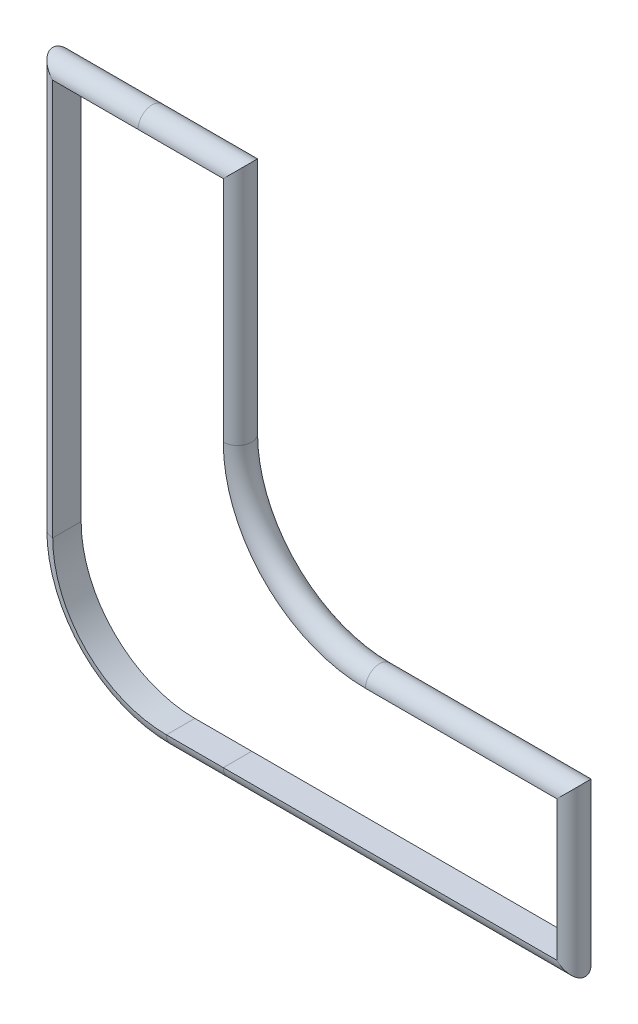
ISO-10303-21;
HEADER;
FILE_DESCRIPTION(('STEP AP214'),'2;1');
FILE_NAME('part.step','',(''),(''),'','','');
FILE_SCHEMA(('AUTOMOTIVE_DESIGN { 1 0 10303 214 1 1 1 1 }'));
ENDSEC;
DATA;
#1=APPLICATION_CONTEXT('core data for automotive mechanical design processes');
#2=APPLICATION_PROTOCOL_DEFINITION('international standard','automotive_design',2000,#1);
#3=PRODUCT_CONTEXT('',#1,'mechanical');
#4=PRODUCT('Part','Part','',(#3));
#5=PRODUCT_RELATED_PRODUCT_CATEGORY('part','',(#4));
#6=PRODUCT_DEFINITION_FORMATION('','',#4);
#7=PRODUCT_DEFINITION_CONTEXT('part definition',#1,'design');
#8=PRODUCT_DEFINITION('design','',#6,#7);
#9=PRODUCT_DEFINITION_SHAPE('','',#8);
#10=(LENGTH_UNIT() NAMED_UNIT(*) SI_UNIT(.MILLI.,.METRE.));
#11=(NAMED_UNIT(*) PLANE_ANGLE_UNIT() SI_UNIT($,.RADIAN.));
#12=(NAMED_UNIT(*) SI_UNIT($,.STERADIAN.) SOLID_ANGLE_UNIT());
#13=UNCERTAINTY_MEASURE_WITH_UNIT(LENGTH_MEASURE(1.E-05),#10,'distance_accuracy_value','');
#14=(GEOMETRIC_REPRESENTATION_CONTEXT(3) GLOBAL_UNCERTAINTY_ASSIGNED_CONTEXT((#13)) GLOBAL_UNIT_ASSIGNED_CONTEXT((#10,
#11,#12)) REPRESENTATION_CONTEXT('',''));
#15=CARTESIAN_POINT('',(0.,0.,0.));
#16=DIRECTION('',(0.,0.,1.));
#17=DIRECTION('',(1.,0.,0.));
#18=AXIS2_PLACEMENT_3D('',#15,#16,#17);
#19=CARTESIAN_POINT('',(0.936808624207441,-0.547273546102289,0.));
#20=DIRECTION('',(-1.,0.,0.));
#21=DIRECTION('',(0.,0.,1.));
#22=AXIS2_PLACEMENT_3D('',#19,#20,#21);
#23=CYLINDRICAL_SURFACE('',#22,0.025);
#24=CARTESIAN_POINT('',(0.736808624207441,-0.547273546102289,0.));
#25=DIRECTION('',(-0.707106781186547,-0.707106781186548,0.));
#26=DIRECTION('',(0.707106781186548,-0.707106781186547,0.));
#27=AXIS2_PLACEMENT_3D('',#24,#25,#26);
#28=ELLIPSE('',#27,0.0353553390593274,0.025);
#29=CARTESIAN_POINT('',(0.736808624207441,-0.547273546102289,0.025));
#30=VERTEX_POINT('',#29);
#31=CARTESIAN_POINT('',(0.736808624207441,-0.547273546102289,-0.025));
#32=VERTEX_POINT('',#31);
#33=EDGE_CURVE('E157',#30,#32,#28,.F.);
#34=ORIENTED_EDGE('',*,*,#33,.F.);
#35=DIRECTION('',(-1.,0.,0.));
#36=VECTOR('',#35,1.);
#37=CARTESIAN_POINT('',(0.936808624207441,-0.547273546102289,0.025));
#38=LINE('',#37,#36);
#39=CARTESIAN_POINT('',(0.15,-0.547273546102289,0.025));
#40=VERTEX_POINT('',#39);
#41=EDGE_CURVE('E173',#30,#40,#38,.T.);
#42=ORIENTED_EDGE('',*,*,#41,.T.);
#43=CARTESIAN_POINT('',(0.15,-0.547273546102289,0.));
#44=DIRECTION('',(-1.,0.,0.));
#45=DIRECTION('',(0.,0.,-1.));
#46=AXIS2_PLACEMENT_3D('',#43,#44,#45);
#47=CIRCLE('',#46,0.025);
#48=CARTESIAN_POINT('',(0.15,-0.547273546102289,-0.025));
#49=VERTEX_POINT('',#48);
#50=EDGE_CURVE('E133',#49,#40,#47,.T.);
#51=ORIENTED_EDGE('',*,*,#50,.F.);
#52=DIRECTION('',(-1.,0.,0.));
#53=VECTOR('',#52,1.);
#54=CARTESIAN_POINT('',(0.936808624207441,-0.547273546102289,-0.025));
#55=LINE('',#54,#53);
#56=EDGE_CURVE('E171',#32,#49,#55,.T.);
#57=ORIENTED_EDGE('',*,*,#56,.F.);
#58=EDGE_LOOP('',(#34,#42,#51,#57));
#59=FACE_BOUND('',#58,.T.);
#60=ADVANCED_FACE('F33',(#59),#23,.T.);
#61=CARTESIAN_POINT('',(0.936808624207441,-0.547273546102289,0.025));
#62=DIRECTION('',(0.,1.,0.));
#63=DIRECTION('',(0.,0.,1.));
#64=AXIS2_PLACEMENT_3D('',#61,#62,#63);
#65=PLANE('',#64);
#66=DIRECTION('',(0.,0.,1.));
#67=VECTOR('',#66,1.);
#68=CARTESIAN_POINT('',(0.736808624207441,-0.547273546102289,0.025));
#69=LINE('',#68,#67);
#70=EDGE_CURVE('E105',#32,#30,#69,.T.);
#71=ORIENTED_EDGE('',*,*,#70,.F.);
#72=ORIENTED_EDGE('',*,*,#56,.T.);
#73=DIRECTION('',(0.,0.,-1.));
#74=VECTOR('',#73,1.);
#75=CARTESIAN_POINT('',(0.15,-0.547273546102289,0.025));
#76=LINE('',#75,#74);
#77=EDGE_CURVE('E130',#40,#49,#76,.T.);
#78=ORIENTED_EDGE('',*,*,#77,.F.);
#79=ORIENTED_EDGE('',*,*,#41,.F.);
#80=EDGE_LOOP('',(#71,#72,#78,#79));
#81=FACE_BOUND('',#80,.T.);
#82=ADVANCED_FACE('F191',(#81),#65,.T.);
#83=CARTESIAN_POINT('',(0.15,-0.547273546102289,0.));
#84=DIRECTION('',(-1.,0.,0.));
#85=DIRECTION('',(0.,-1.,0.));
#86=AXIS2_PLACEMENT_3D('',#83,#84,#85);
#87=CYLINDRICAL_SURFACE('',#86,0.025);
#88=DIRECTION('',(-1.,0.,0.));
#89=VECTOR('',#88,1.);
#90=CARTESIAN_POINT('',(0.15,-0.547273546102289,0.025));
#91=LINE('',#90,#89);
#92=CARTESIAN_POINT('',(0.0500000000000001,-0.547273546102289,0.025));
#93=VERTEX_POINT('',#92);
#94=EDGE_CURVE('E134',#40,#93,#91,.T.);
#95=ORIENTED_EDGE('',*,*,#94,.T.);
#96=CARTESIAN_POINT('',(0.0500000000000001,-0.547273546102289,0.));
#97=DIRECTION('',(-1.,0.,0.));
#98=DIRECTION('',(0.,0.,-1.));
#99=AXIS2_PLACEMENT_3D('',#96,#97,#98);
#100=CIRCLE('',#99,0.025);
#101=CARTESIAN_POINT('',(0.0500000000000001,-0.547273546102289,-0.025));
#102=VERTEX_POINT('',#101);
#103=EDGE_CURVE('E120',#102,#93,#100,.T.);
#104=ORIENTED_EDGE('',*,*,#103,.F.);
#105=DIRECTION('',(-1.,0.,0.));
#106=VECTOR('',#105,1.);
#107=CARTESIAN_POINT('',(0.15,-0.547273546102289,-0.025));
#108=LINE('',#107,#106);
#109=EDGE_CURVE('E127',#49,#102,#108,.T.);
#110=ORIENTED_EDGE('',*,*,#109,.F.);
#111=ORIENTED_EDGE('',*,*,#50,.T.);
#112=EDGE_LOOP('',(#95,#104,#110,#111));
#113=FACE_BOUND('',#112,.T.);
#114=ADVANCED_FACE('F181',(#113),#87,.T.);
#115=CARTESIAN_POINT('',(0.15,-0.547273546102289,0.025));
#116=DIRECTION('',(0.,1.,0.));
#117=DIRECTION('',(-1.,0.,0.));
#118=AXIS2_PLACEMENT_3D('',#115,#116,#117);
#119=PLANE('',#118);
#120=DIRECTION('',(0.,0.,-1.));
#121=VECTOR('',#120,1.);
#122=CARTESIAN_POINT('',(0.0500000000000001,-0.547273546102289,0.025));
#123=LINE('',#122,#121);
#124=EDGE_CURVE('E124',#93,#102,#123,.T.);
#125=ORIENTED_EDGE('',*,*,#124,.F.);
#126=ORIENTED_EDGE('',*,*,#94,.F.);
#127=ORIENTED_EDGE('',*,*,#77,.T.);
#128=ORIENTED_EDGE('',*,*,#109,.T.);
#129=EDGE_LOOP('',(#125,#126,#127,#128));
#130=FACE_BOUND('',#129,.T.);
#131=ADVANCED_FACE('F187',(#130),#119,.T.);
#132=CARTESIAN_POINT('',(0.05,-0.347273546102289,0.));
#133=DIRECTION('',(0.,0.,-1.));
#134=DIRECTION('',(-1.,0.,0.));
#135=AXIS2_PLACEMENT_3D('',#132,#133,#134);
#136=TOROIDAL_SURFACE('',#135,0.2,0.025);
#137=CARTESIAN_POINT('',(0.05,-0.347273546102289,0.025));
#138=DIRECTION('',(0.,0.,-1.));
#139=DIRECTION('',(0.,-1.,0.));
#140=AXIS2_PLACEMENT_3D('',#137,#138,#139);
#141=CIRCLE('',#140,0.2);
#142=CARTESIAN_POINT('',(-0.15,-0.347273546102289,0.025));
#143=VERTEX_POINT('',#142);
#144=EDGE_CURVE('E111',#93,#143,#141,.T.);
#145=ORIENTED_EDGE('',*,*,#144,.T.);
#146=CARTESIAN_POINT('',(-0.15,-0.347273546102289,0.));
#147=DIRECTION('',(0.,1.,0.));
#148=DIRECTION('',(0.,0.,-1.));
#149=AXIS2_PLACEMENT_3D('',#146,#147,#148);
#150=CIRCLE('',#149,0.025);
#151=CARTESIAN_POINT('',(-0.15,-0.347273546102289,-0.025));
#152=VERTEX_POINT('',#151);
#153=EDGE_CURVE('E118',#152,#143,#150,.T.);
#154=ORIENTED_EDGE('',*,*,#153,.F.);
#155=CARTESIAN_POINT('',(0.05,-0.347273546102289,-0.025));
#156=DIRECTION('',(0.,0.,-1.));
#157=DIRECTION('',(0.,-1.,0.));
#158=AXIS2_PLACEMENT_3D('',#155,#156,#157);
#159=CIRCLE('',#158,0.2);
#160=EDGE_CURVE('E113',#102,#152,#159,.T.);
#161=ORIENTED_EDGE('',*,*,#160,.F.);
#162=ORIENTED_EDGE('',*,*,#103,.T.);
#163=EDGE_LOOP('',(#145,#154,#161,#162));
#164=FACE_BOUND('',#163,.T.);
#165=ADVANCED_FACE('F117',(#164),#136,.T.);
#166=CARTESIAN_POINT('',(0.05,-0.347273546102289,0.));
#167=DIRECTION('',(0.,0.,-1.));
#168=DIRECTION('',(-1.,0.,0.));
#169=AXIS2_PLACEMENT_3D('',#166,#167,#168);
#170=CYLINDRICAL_SURFACE('',#169,0.2);
#171=DIRECTION('',(0.,0.,-1.));
#172=VECTOR('',#171,1.);
#173=CARTESIAN_POINT('',(-0.15,-0.347273546102289,0.025));
#174=LINE('',#173,#172);
#175=EDGE_CURVE('E100',#143,#152,#174,.T.);
#176=ORIENTED_EDGE('',*,*,#175,.F.);
#177=ORIENTED_EDGE('',*,*,#144,.F.);
#178=ORIENTED_EDGE('',*,*,#124,.T.);
#179=ORIENTED_EDGE('',*,*,#160,.T.);
#180=EDGE_LOOP('',(#176,#177,#178,#179));
#181=FACE_BOUND('',#180,.T.);
#182=ADVANCED_FACE('F109',(#181),#170,.F.);
#183=CARTESIAN_POINT('',(-0.15,-0.347273546102289,0.));
#184=DIRECTION('',(0.,1.,0.));
#185=DIRECTION('',(-1.,0.,0.));
#186=AXIS2_PLACEMENT_3D('',#183,#184,#185);
#187=CYLINDRICAL_SURFACE('',#186,0.025);
#188=DIRECTION('',(0.,1.,0.));
#189=VECTOR('',#188,1.);
#190=CARTESIAN_POINT('',(-0.15,-0.347273546102289,0.025));
#191=LINE('',#190,#189);
#192=CARTESIAN_POINT('',(-0.15,0.35,0.025));
#193=VERTEX_POINT('',#192);
#194=EDGE_CURVE('E37',#143,#193,#191,.T.);
#195=ORIENTED_EDGE('',*,*,#194,.T.);
#196=CARTESIAN_POINT('',(-0.15,0.35,0.));
#197=DIRECTION('',(0.707106781186548,0.707106781186548,0.));
#198=DIRECTION('',(0.707106781186548,-0.707106781186548,0.));
#199=AXIS2_PLACEMENT_3D('',#196,#197,#198);
#200=ELLIPSE('',#199,0.0353553390593273,0.025);
#201=CARTESIAN_POINT('',(-0.15,0.35,-0.025));
#202=VERTEX_POINT('',#201);
#203=EDGE_CURVE('E143',#193,#202,#200,.F.);
#204=ORIENTED_EDGE('',*,*,#203,.T.);
#205=DIRECTION('',(0.,1.,0.));
#206=VECTOR('',#205,1.);
#207=CARTESIAN_POINT('',(-0.15,-0.347273546102289,-0.025));
#208=LINE('',#207,#206);
#209=EDGE_CURVE('E94',#152,#202,#208,.T.);
#210=ORIENTED_EDGE('',*,*,#209,.F.);
#211=ORIENTED_EDGE('',*,*,#153,.T.);
#212=EDGE_LOOP('',(#195,#204,#210,#211));
#213=FACE_BOUND('',#212,.T.);
#214=ADVANCED_FACE('F122',(#213),#187,.T.);
#215=CARTESIAN_POINT('',(-0.15,-0.347273546102289,0.025));
#216=DIRECTION('',(1.,0.,0.));
#217=DIRECTION('',(0.,1.,0.));
#218=AXIS2_PLACEMENT_3D('',#215,#216,#217);
#219=PLANE('',#218);
#220=ORIENTED_EDGE('',*,*,#209,.T.);
#221=DIRECTION('',(0.,0.,1.));
#222=VECTOR('',#221,1.);
#223=CARTESIAN_POINT('',(-0.15,0.35,0.025));
#224=LINE('',#223,#222);
#225=EDGE_CURVE('E103',#202,#193,#224,.T.);
#226=ORIENTED_EDGE('',*,*,#225,.T.);
#227=ORIENTED_EDGE('',*,*,#194,.F.);
#228=ORIENTED_EDGE('',*,*,#175,.T.);
#229=EDGE_LOOP('',(#220,#226,#227,#228));
#230=FACE_BOUND('',#229,.T.);
#231=ADVANCED_FACE('F35',(#230),#219,.T.);
#232=CARTESIAN_POINT('',(-0.35,0.35,0.));
#233=DIRECTION('',(1.,0.,0.));
#234=DIRECTION('',(0.,0.,-1.));
#235=AXIS2_PLACEMENT_3D('',#232,#233,#234);
#236=CYLINDRICAL_SURFACE('',#235,0.025);
#237=ORIENTED_EDGE('',*,*,#203,.F.);
#238=DIRECTION('',(1.,0.,0.));
#239=VECTOR('',#238,1.);
#240=CARTESIAN_POINT('',(-0.35,0.35,0.025));
#241=LINE('',#240,#239);
#242=CARTESIAN_POINT('',(0.,0.35,0.025));
#243=VERTEX_POINT('',#242);
#244=EDGE_CURVE('E142',#193,#243,#241,.T.);
#245=ORIENTED_EDGE('',*,*,#244,.T.);
#246=CARTESIAN_POINT('',(0.,0.35,0.));
#247=DIRECTION('',(1.,0.,0.));
#248=DIRECTION('',(0.,0.,-1.));
#249=AXIS2_PLACEMENT_3D('',#246,#247,#248);
#250=CIRCLE('',#249,0.025);
#251=CARTESIAN_POINT('',(0.,0.35,-0.025));
#252=VERTEX_POINT('',#251);
#253=EDGE_CURVE('E150',#252,#243,#250,.T.);
#254=ORIENTED_EDGE('',*,*,#253,.F.);
#255=DIRECTION('',(1.,0.,0.));
#256=VECTOR('',#255,1.);
#257=CARTESIAN_POINT('',(-0.35,0.35,-0.025));
#258=LINE('',#257,#256);
#259=EDGE_CURVE('E140',#202,#252,#258,.T.);
#260=ORIENTED_EDGE('',*,*,#259,.F.);
#261=EDGE_LOOP('',(#237,#245,#254,#260));
#262=FACE_BOUND('',#261,.T.);
#263=ADVANCED_FACE('F148',(#262),#236,.T.);
#264=CARTESIAN_POINT('',(-0.35,0.35,0.025));
#265=DIRECTION('',(0.,-1.,0.));
#266=DIRECTION('',(0.,0.,-1.));
#267=AXIS2_PLACEMENT_3D('',#264,#265,#266);
#268=PLANE('',#267);
#269=ORIENTED_EDGE('',*,*,#225,.F.);
#270=ORIENTED_EDGE('',*,*,#259,.T.);
#271=DIRECTION('',(0.,0.,-1.));
#272=VECTOR('',#271,1.);
#273=CARTESIAN_POINT('',(0.,0.35,0.025));
#274=LINE('',#273,#272);
#275=EDGE_CURVE('E163',#243,#252,#274,.T.);
#276=ORIENTED_EDGE('',*,*,#275,.F.);
#277=ORIENTED_EDGE('',*,*,#244,.F.);
#278=EDGE_LOOP('',(#269,#270,#276,#277));
#279=FACE_BOUND('',#278,.T.);
#280=ADVANCED_FACE('F138',(#279),#268,.T.);
#281=CARTESIAN_POINT('',(0.,0.35,0.));
#282=DIRECTION('',(1.,0.,0.));
#283=DIRECTION('',(0.,0.,-1.));
#284=AXIS2_PLACEMENT_3D('',#281,#282,#283);
#285=CYLINDRICAL_SURFACE('',#284,0.025);
#286=DIRECTION('',(1.,0.,0.));
#287=VECTOR('',#286,1.);
#288=CARTESIAN_POINT('',(0.,0.35,0.025));
#289=LINE('',#288,#287);
#290=CARTESIAN_POINT('',(0.15,0.35,0.025));
#291=VERTEX_POINT('',#290);
#292=EDGE_CURVE('E144',#243,#291,#289,.T.);
#293=ORIENTED_EDGE('',*,*,#292,.T.);
#294=CARTESIAN_POINT('',(0.15,0.35,0.));
#295=DIRECTION('',(0.707106781186547,-0.707106781186548,0.));
#296=DIRECTION('',(-0.707106781186548,-0.707106781186547,0.));
#297=AXIS2_PLACEMENT_3D('',#294,#295,#296);
#298=ELLIPSE('',#297,0.0353553390593273,0.025);
#299=CARTESIAN_POINT('',(0.15,0.35,-0.025));
#300=VERTEX_POINT('',#299);
#301=EDGE_CURVE('E195',#291,#300,#298,.F.);
#302=ORIENTED_EDGE('',*,*,#301,.T.);
#303=DIRECTION('',(1.,0.,0.));
#304=VECTOR('',#303,1.);
#305=CARTESIAN_POINT('',(0.,0.35,-0.025));
#306=LINE('',#305,#304);
#307=EDGE_CURVE('E165',#252,#300,#306,.T.);
#308=ORIENTED_EDGE('',*,*,#307,.F.);
#309=ORIENTED_EDGE('',*,*,#253,.T.);
#310=EDGE_LOOP('',(#293,#302,#308,#309));
#311=FACE_BOUND('',#310,.T.);
#312=ADVANCED_FACE('F251',(#311),#285,.T.);
#313=CARTESIAN_POINT('',(0.,0.35,0.025));
#314=DIRECTION('',(0.,-1.,0.));
#315=DIRECTION('',(0.,0.,-1.));
#316=AXIS2_PLACEMENT_3D('',#313,#314,#315);
#317=PLANE('',#316);
#318=ORIENTED_EDGE('',*,*,#307,.T.);
#319=DIRECTION('',(0.,0.,1.));
#320=VECTOR('',#319,1.);
#321=CARTESIAN_POINT('',(0.15,0.35,0.025));
#322=LINE('',#321,#320);
#323=EDGE_CURVE('E151',#300,#291,#322,.T.);
#324=ORIENTED_EDGE('',*,*,#323,.T.);
#325=ORIENTED_EDGE('',*,*,#292,.F.);
#326=ORIENTED_EDGE('',*,*,#275,.T.);
#327=EDGE_LOOP('',(#318,#324,#325,#326));
#328=FACE_BOUND('',#327,.T.);
#329=ADVANCED_FACE('F254',(#328),#317,.T.);
#330=CARTESIAN_POINT('',(0.736808624207441,-0.10137484740867,0.025));
#331=DIRECTION('',(-1.,0.,0.));
#332=DIRECTION('',(0.,-1.,0.));
#333=AXIS2_PLACEMENT_3D('',#330,#331,#332);
#334=PLANE('',#333);
#335=DIRECTION('',(0.,-1.,0.));
#336=VECTOR('',#335,1.);
#337=CARTESIAN_POINT('',(0.736808624207441,-0.10137484740867,-0.025));
#338=LINE('',#337,#336);
#339=CARTESIAN_POINT('',(0.736808624207441,-0.30137484740867,-0.025));
#340=VERTEX_POINT('',#339);
#341=EDGE_CURVE('E52',#340,#32,#338,.T.);
#342=ORIENTED_EDGE('',*,*,#341,.T.);
#343=ORIENTED_EDGE('',*,*,#70,.T.);
#344=DIRECTION('',(0.,-1.,0.));
#345=VECTOR('',#344,1.);
#346=CARTESIAN_POINT('',(0.736808624207441,-0.10137484740867,0.025));
#347=LINE('',#346,#345);
#348=CARTESIAN_POINT('',(0.736808624207441,-0.30137484740867,0.025));
#349=VERTEX_POINT('',#348);
#350=EDGE_CURVE('E199',#349,#30,#347,.T.);
#351=ORIENTED_EDGE('',*,*,#350,.F.);
#352=DIRECTION('',(0.,0.,1.));
#353=VECTOR('',#352,1.);
#354=CARTESIAN_POINT('',(0.736808624207441,-0.30137484740867,0.025));
#355=LINE('',#354,#353);
#356=EDGE_CURVE('E160',#340,#349,#355,.T.);
#357=ORIENTED_EDGE('',*,*,#356,.F.);
#358=EDGE_LOOP('',(#342,#343,#351,#357));
#359=FACE_BOUND('',#358,.T.);
#360=ADVANCED_FACE('F321',(#359),#334,.T.);
#361=CARTESIAN_POINT('',(0.736808624207441,-0.10137484740867,0.));
#362=DIRECTION('',(0.,-1.,0.));
#363=DIRECTION('',(1.,0.,0.));
#364=AXIS2_PLACEMENT_3D('',#361,#362,#363);
#365=CYLINDRICAL_SURFACE('',#364,0.025);
#366=ORIENTED_EDGE('',*,*,#350,.T.);
#367=ORIENTED_EDGE('',*,*,#33,.T.);
#368=ORIENTED_EDGE('',*,*,#341,.F.);
#369=CARTESIAN_POINT('',(0.736808624207441,-0.30137484740867,0.));
#370=DIRECTION('',(0.707106781186548,-0.707106781186547,0.));
#371=DIRECTION('',(0.707106781186547,0.707106781186548,0.));
#372=AXIS2_PLACEMENT_3D('',#369,#370,#371);
#373=ELLIPSE('',#372,0.0353553390593273,0.025);
#374=EDGE_CURVE('E11',#349,#340,#373,.F.);
#375=ORIENTED_EDGE('',*,*,#374,.F.);
#376=EDGE_LOOP('',(#366,#367,#368,#375));
#377=FACE_BOUND('',#376,.T.);
#378=ADVANCED_FACE('F313',(#377),#365,.T.);
#379=CARTESIAN_POINT('',(0.15,0.55,0.));
#380=DIRECTION('',(0.,-1.,0.));
#381=DIRECTION('',(1.,0.,0.));
#382=AXIS2_PLACEMENT_3D('',#379,#380,#381);
#383=CYLINDRICAL_SURFACE('',#382,0.025);
#384=ORIENTED_EDGE('',*,*,#301,.F.);
#385=DIRECTION('',(0.,-1.,0.));
#386=VECTOR('',#385,1.);
#387=CARTESIAN_POINT('',(0.15,0.55,0.025));
#388=LINE('',#387,#386);
#389=CARTESIAN_POINT('',(0.15,-0.05137484740867,0.025));
#390=VERTEX_POINT('',#389);
#391=EDGE_CURVE('E204',#291,#390,#388,.T.);
#392=ORIENTED_EDGE('',*,*,#391,.T.);
#393=CARTESIAN_POINT('',(0.15,-0.05137484740867,0.));
#394=DIRECTION('',(0.,-1.,0.));
#395=DIRECTION('',(0.,0.,-1.));
#396=AXIS2_PLACEMENT_3D('',#393,#394,#395);
#397=CIRCLE('',#396,0.025);
#398=CARTESIAN_POINT('',(0.15,-0.05137484740867,-0.025));
#399=VERTEX_POINT('',#398);
#400=EDGE_CURVE('E207',#399,#390,#397,.T.);
#401=ORIENTED_EDGE('',*,*,#400,.F.);
#402=DIRECTION('',(0.,-1.,0.));
#403=VECTOR('',#402,1.);
#404=CARTESIAN_POINT('',(0.15,0.55,-0.025));
#405=LINE('',#404,#403);
#406=EDGE_CURVE('E197',#300,#399,#405,.T.);
#407=ORIENTED_EDGE('',*,*,#406,.F.);
#408=EDGE_LOOP('',(#384,#392,#401,#407));
#409=FACE_BOUND('',#408,.T.);
#410=ADVANCED_FACE('F259',(#409),#383,.T.);
#411=CARTESIAN_POINT('',(0.15,0.55,0.025));
#412=DIRECTION('',(-1.,0.,0.));
#413=DIRECTION('',(0.,-1.,0.));
#414=AXIS2_PLACEMENT_3D('',#411,#412,#413);
#415=PLANE('',#414);
#416=ORIENTED_EDGE('',*,*,#323,.F.);
#417=ORIENTED_EDGE('',*,*,#406,.T.);
#418=DIRECTION('',(0.,0.,-1.));
#419=VECTOR('',#418,1.);
#420=CARTESIAN_POINT('',(0.15,-0.05137484740867,0.025));
#421=LINE('',#420,#419);
#422=EDGE_CURVE('E215',#390,#399,#421,.T.);
#423=ORIENTED_EDGE('',*,*,#422,.F.);
#424=ORIENTED_EDGE('',*,*,#391,.F.);
#425=EDGE_LOOP('',(#416,#417,#423,#424));
#426=FACE_BOUND('',#425,.T.);
#427=ADVANCED_FACE('F263',(#426),#415,.T.);
#428=CARTESIAN_POINT('',(0.4,-0.0513748474086696,0.));
#429=DIRECTION('',(0.,0.,1.));
#430=DIRECTION('',(1.,0.,0.));
#431=AXIS2_PLACEMENT_3D('',#428,#429,#430);
#432=TOROIDAL_SURFACE('',#431,0.25,0.025);
#433=CARTESIAN_POINT('',(0.4,-0.0513748474086696,0.025));
#434=DIRECTION('',(0.,0.,1.));
#435=DIRECTION('',(-1.,0.,0.));
#436=AXIS2_PLACEMENT_3D('',#433,#434,#435);
#437=CIRCLE('',#436,0.25);
#438=CARTESIAN_POINT('',(0.400000000000001,-0.30137484740867,0.025));
#439=VERTEX_POINT('',#438);
#440=EDGE_CURVE('E214',#390,#439,#437,.T.);
#441=ORIENTED_EDGE('',*,*,#440,.T.);
#442=CARTESIAN_POINT('',(0.400000000000001,-0.30137484740867,0.));
#443=DIRECTION('',(1.,0.,0.));
#444=DIRECTION('',(0.,0.,-1.));
#445=AXIS2_PLACEMENT_3D('',#442,#443,#444);
#446=CIRCLE('',#445,0.025);
#447=CARTESIAN_POINT('',(0.400000000000001,-0.30137484740867,-0.025));
#448=VERTEX_POINT('',#447);
#449=EDGE_CURVE('E221',#448,#439,#446,.T.);
#450=ORIENTED_EDGE('',*,*,#449,.F.);
#451=CARTESIAN_POINT('',(0.4,-0.0513748474086696,-0.025));
#452=DIRECTION('',(0.,0.,1.));
#453=DIRECTION('',(-1.,0.,0.));
#454=AXIS2_PLACEMENT_3D('',#451,#452,#453);
#455=CIRCLE('',#454,0.25);
#456=EDGE_CURVE('E218',#399,#448,#455,.T.);
#457=ORIENTED_EDGE('',*,*,#456,.F.);
#458=ORIENTED_EDGE('',*,*,#400,.T.);
#459=EDGE_LOOP('',(#441,#450,#457,#458));
#460=FACE_BOUND('',#459,.T.);
#461=ADVANCED_FACE('F267',(#460),#432,.T.);
#462=CARTESIAN_POINT('',(0.4,-0.0513748474086696,0.));
#463=DIRECTION('',(0.,0.,1.));
#464=DIRECTION('',(1.,0.,0.));
#465=AXIS2_PLACEMENT_3D('',#462,#463,#464);
#466=CYLINDRICAL_SURFACE('',#465,0.25);
#467=DIRECTION('',(0.,0.,-1.));
#468=VECTOR('',#467,1.);
#469=CARTESIAN_POINT('',(0.400000000000001,-0.30137484740867,0.025));
#470=LINE('',#469,#468);
#471=EDGE_CURVE('E210',#439,#448,#470,.T.);
#472=ORIENTED_EDGE('',*,*,#471,.F.);
#473=ORIENTED_EDGE('',*,*,#440,.F.);
#474=ORIENTED_EDGE('',*,*,#422,.T.);
#475=ORIENTED_EDGE('',*,*,#456,.T.);
#476=EDGE_LOOP('',(#472,#473,#474,#475));
#477=FACE_BOUND('',#476,.T.);
#478=ADVANCED_FACE('F268',(#477),#466,.T.);
#479=CARTESIAN_POINT('',(0.4,-0.30137484740867,0.));
#480=DIRECTION('',(1.,0.,0.));
#481=DIRECTION('',(0.,0.,-1.));
#482=AXIS2_PLACEMENT_3D('',#479,#480,#481);
#483=CYLINDRICAL_SURFACE('',#482,0.025);
#484=DIRECTION('',(1.,0.,0.));
#485=VECTOR('',#484,1.);
#486=CARTESIAN_POINT('',(0.4,-0.30137484740867,0.025));
#487=LINE('',#486,#485);
#488=EDGE_CURVE('E43',#439,#349,#487,.T.);
#489=ORIENTED_EDGE('',*,*,#488,.T.);
#490=ORIENTED_EDGE('',*,*,#374,.T.);
#491=DIRECTION('',(1.,0.,0.));
#492=VECTOR('',#491,1.);
#493=CARTESIAN_POINT('',(0.4,-0.30137484740867,-0.025));
#494=LINE('',#493,#492);
#495=EDGE_CURVE('E213',#448,#340,#494,.T.);
#496=ORIENTED_EDGE('',*,*,#495,.F.);
#497=ORIENTED_EDGE('',*,*,#449,.T.);
#498=EDGE_LOOP('',(#489,#490,#496,#497));
#499=FACE_BOUND('',#498,.T.);
#500=ADVANCED_FACE('F239',(#499),#483,.T.);
#501=CARTESIAN_POINT('',(0.4,-0.30137484740867,0.025));
#502=DIRECTION('',(0.,-1.,0.));
#503=DIRECTION('',(0.,0.,-1.));
#504=AXIS2_PLACEMENT_3D('',#501,#502,#503);
#505=PLANE('',#504);
#506=ORIENTED_EDGE('',*,*,#495,.T.);
#507=ORIENTED_EDGE('',*,*,#356,.T.);
#508=ORIENTED_EDGE('',*,*,#488,.F.);
#509=ORIENTED_EDGE('',*,*,#471,.T.);
#510=EDGE_LOOP('',(#506,#507,#508,#509));
#511=FACE_BOUND('',#510,.T.);
#512=ADVANCED_FACE('F233',(#511),#505,.T.);
#513=CLOSED_SHELL('',(#60,#82,#114,#131,#165,#182,#214,#231,#263,#280,#312,#329,#360,#378,#410,
#427,#461,#478,#500,#512));
#514=MANIFOLD_SOLID_BREP('B2',#513);
#515=ADVANCED_BREP_SHAPE_REPRESENTATION('',(#18,#514),#14);
#516=SHAPE_DEFINITION_REPRESENTATION(#9,#515);
ENDSEC;
END-ISO-10303-21;
